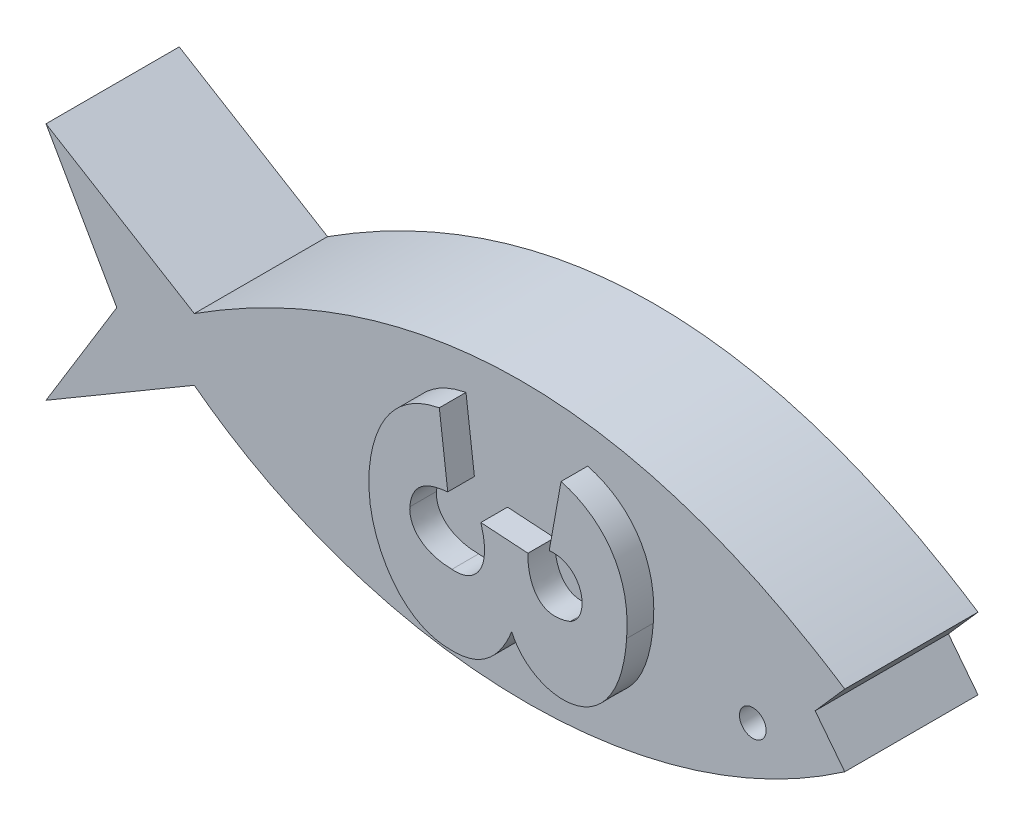
ISO-10303-21;
HEADER;
FILE_DESCRIPTION(('STEP AP214'),'2;1');
FILE_NAME('part.step','',(''),(''),'','','');
FILE_SCHEMA(('AUTOMOTIVE_DESIGN { 1 0 10303 214 1 1 1 1 }'));
ENDSEC;
DATA;
#1=APPLICATION_CONTEXT('core data for automotive mechanical design processes');
#2=APPLICATION_PROTOCOL_DEFINITION('international standard','automotive_design',2000,#1);
#3=PRODUCT_CONTEXT('',#1,'mechanical');
#4=PRODUCT('Part','Part','',(#3));
#5=PRODUCT_RELATED_PRODUCT_CATEGORY('part','',(#4));
#6=PRODUCT_DEFINITION_FORMATION('','',#4);
#7=PRODUCT_DEFINITION_CONTEXT('part definition',#1,'design');
#8=PRODUCT_DEFINITION('design','',#6,#7);
#9=PRODUCT_DEFINITION_SHAPE('','',#8);
#10=(LENGTH_UNIT() NAMED_UNIT(*) SI_UNIT(.MILLI.,.METRE.));
#11=(NAMED_UNIT(*) PLANE_ANGLE_UNIT() SI_UNIT($,.RADIAN.));
#12=(NAMED_UNIT(*) SI_UNIT($,.STERADIAN.) SOLID_ANGLE_UNIT());
#13=UNCERTAINTY_MEASURE_WITH_UNIT(LENGTH_MEASURE(1.E-05),#10,'distance_accuracy_value','');
#14=(GEOMETRIC_REPRESENTATION_CONTEXT(3) GLOBAL_UNCERTAINTY_ASSIGNED_CONTEXT((#13)) GLOBAL_UNIT_ASSIGNED_CONTEXT((#10,
#11,#12)) REPRESENTATION_CONTEXT('',''));
#15=CARTESIAN_POINT('',(0.,0.,0.));
#16=DIRECTION('',(0.,0.,1.));
#17=DIRECTION('',(1.,0.,0.));
#18=AXIS2_PLACEMENT_3D('',#15,#16,#17);
#19=CARTESIAN_POINT('',(17.259438939303,-10.3520637776499,5.));
#20=DIRECTION('',(0.,0.,-1.));
#21=DIRECTION('',(-1.,0.,0.));
#22=AXIS2_PLACEMENT_3D('',#19,#20,#21);
#23=PLANE('',#22);
#24=CARTESIAN_POINT('',(29.9729583496422,-6.64273710384665,5.));
#25=CARTESIAN_POINT('',(22.1417553800262,-12.0787378702692,5.));
#26=CARTESIAN_POINT('',(12.037313537676,-11.2172776076084,5.));
#27=CARTESIAN_POINT('',(5.56534641167516,-6.28572668371996,5.));
#28=B_SPLINE_CURVE_WITH_KNOTS('',3,(#24,#25,#26,#27),.UNSPECIFIED.,.F.,.F.,(4,4),(0.,1.),.UNSPECIFIED.);
#29=CARTESIAN_POINT('',(29.9729583496422,-6.64273710384666,5.));
#30=VERTEX_POINT('',#29);
#31=CARTESIAN_POINT('',(5.56534641167516,-6.28572668371996,5.));
#32=VERTEX_POINT('',#31);
#33=EDGE_CURVE('E210',#30,#32,#28,.T.);
#34=ORIENTED_EDGE('',*,*,#33,.F.);
#35=DIRECTION('',(0.614154388439045,-0.789185901521982,0.));
#36=VECTOR('',#35,1.);
#37=CARTESIAN_POINT('',(29.9729583496422,-6.64273710384666,5.));
#38=LINE('',#37,#36);
#39=CARTESIAN_POINT('',(28.8624377925117,-5.21572268607917,5.));
#40=VERTEX_POINT('',#39);
#41=EDGE_CURVE('E315',#40,#30,#38,.T.);
#42=ORIENTED_EDGE('',*,*,#41,.F.);
#43=DIRECTION('',(-0.660642607187039,-0.750700569847333,0.));
#44=VECTOR('',#43,1.);
#45=CARTESIAN_POINT('',(28.8624377925117,-5.21572268607917,5.));
#46=LINE('',#45,#44);
#47=CARTESIAN_POINT('',(29.9729583496422,-3.95381737449974,5.));
#48=VERTEX_POINT('',#47);
#49=EDGE_CURVE('E238',#48,#40,#46,.T.);
#50=ORIENTED_EDGE('',*,*,#49,.F.);
#51=CARTESIAN_POINT('',(5.56534641167516,-3.95381737449974,5.));
#52=CARTESIAN_POINT('',(17.9190768037639,3.93971731756191,5.));
#53=CARTESIAN_POINT('',(29.9729583496422,-3.95381737449974,5.));
#54=B_SPLINE_CURVE_WITH_KNOTS('',2,(#51,#52,#53),.UNSPECIFIED.,.F.,.F.,(3,3),(0.,1.),.UNSPECIFIED.);
#55=CARTESIAN_POINT('',(5.56534641167516,-3.95381737449974,5.));
#56=VERTEX_POINT('',#55);
#57=EDGE_CURVE('E232',#56,#48,#54,.T.);
#58=ORIENTED_EDGE('',*,*,#57,.F.);
#59=DIRECTION('',(0.854463584925546,-0.519511291538677,0.));
#60=VECTOR('',#59,1.);
#61=CARTESIAN_POINT('',(0.,-0.57010348288733,5.));
#62=LINE('',#61,#60);
#63=CARTESIAN_POINT('',(0.,-0.57010348288733,5.));
#64=VERTEX_POINT('',#63);
#65=EDGE_CURVE('E229',#64,#56,#62,.T.);
#66=ORIENTED_EDGE('',*,*,#65,.F.);
#67=DIRECTION('',(-0.496395302563674,0.868096598076918,0.));
#68=VECTOR('',#67,1.);
#69=CARTESIAN_POINT('',(2.65645960953265,-5.21572268607917,5.));
#70=LINE('',#69,#68);
#71=CARTESIAN_POINT('',(2.65645960953265,-5.21572268607917,5.));
#72=VERTEX_POINT('',#71);
#73=EDGE_CURVE('E226',#72,#64,#70,.T.);
#74=ORIENTED_EDGE('',*,*,#73,.F.);
#75=DIRECTION('',(0.522020846211848,0.852932726608767,0.));
#76=VECTOR('',#75,1.);
#77=CARTESIAN_POINT('',(0.,-9.55612662650962,5.));
#78=LINE('',#77,#76);
#79=CARTESIAN_POINT('',(0.,-9.55612662650962,5.));
#80=VERTEX_POINT('',#79);
#81=EDGE_CURVE('E223',#80,#72,#78,.T.);
#82=ORIENTED_EDGE('',*,*,#81,.F.);
#83=DIRECTION('',(-0.862159793400117,-0.506636448199563,0.));
#84=VECTOR('',#83,1.);
#85=CARTESIAN_POINT('',(5.56534641167516,-6.28572668371996,5.));
#86=LINE('',#85,#84);
#87=EDGE_CURVE('E216',#32,#80,#86,.T.);
#88=ORIENTED_EDGE('',*,*,#87,.F.);
#89=EDGE_LOOP('',(#34,#42,#50,#58,#66,#74,#82,#88));
#90=FACE_BOUND('',#89,.T.);
#91=CARTESIAN_POINT('',(26.5225963003921,-6.78066616591444,5.));
#92=DIRECTION('',(0.,0.,-1.));
#93=DIRECTION('',(-1.,0.,0.));
#94=AXIS2_PLACEMENT_3D('',#91,#92,#93);
#95=CIRCLE('',#94,0.500109692947174);
#96=CARTESIAN_POINT('',(26.0224866074449,-6.78066616591444,5.));
#97=VERTEX_POINT('',#96);
#98=EDGE_CURVE('E202',#97,#97,#95,.T.);
#99=ORIENTED_EDGE('',*,*,#98,.T.);
#100=EDGE_LOOP('',(#99));
#101=FACE_BOUND('',#100,.T.);
#102=CARTESIAN_POINT('',(15.7594494423767,-1.41895303156758,5.));
#103=CARTESIAN_POINT('',(13.3214028190838,-1.88944537605345,5.));
#104=CARTESIAN_POINT('',(13.0534808950552,-4.42870971319118,5.));
#105=CARTESIAN_POINT('',(13.1236711875244,-5.4048919586549,5.));
#106=B_SPLINE_CURVE_WITH_KNOTS('',3,(#102,#103,#104,#105),.UNSPECIFIED.,.F.,.F.,(4,4),(0.,1.),.UNSPECIFIED.);
#107=CARTESIAN_POINT('',(15.7594494423767,-1.41895303156758,5.));
#108=VERTEX_POINT('',#107);
#109=CARTESIAN_POINT('',(13.1236711875244,-5.4048919586549,5.));
#110=VERTEX_POINT('',#109);
#111=EDGE_CURVE('E198',#108,#110,#106,.T.);
#112=ORIENTED_EDGE('',*,*,#111,.F.);
#113=DIRECTION('',(-0.1219069823064,0.992541529440933,0.));
#114=VECTOR('',#113,1.);
#115=CARTESIAN_POINT('',(15.7594494423767,-1.41895303156758,5.));
#116=LINE('',#115,#114);
#117=CARTESIAN_POINT('',(16.0758481304359,-3.99500595173663,5.));
#118=VERTEX_POINT('',#117);
#119=EDGE_CURVE('E195',#118,#108,#116,.T.);
#120=ORIENTED_EDGE('',*,*,#119,.F.);
#121=CARTESIAN_POINT('',(14.6504336042481,-5.19304053566572,5.));
#122=CARTESIAN_POINT('',(14.7409199169432,-4.23839022934074,5.));
#123=CARTESIAN_POINT('',(15.4588807456696,-4.06271008829864,5.));
#124=CARTESIAN_POINT('',(16.0758481304359,-3.99500595173663,5.));
#125=B_SPLINE_CURVE_WITH_KNOTS('',3,(#121,#122,#123,#124),.UNSPECIFIED.,.F.,.F.,(4,4),(0.,1.),.UNSPECIFIED.);
#126=CARTESIAN_POINT('',(14.6504336042481,-5.19304053566572,5.));
#127=VERTEX_POINT('',#126);
#128=EDGE_CURVE('E614',#127,#118,#125,.T.);
#129=ORIENTED_EDGE('',*,*,#128,.F.);
#130=CARTESIAN_POINT('',(16.2321029893553,-6.43243617678024,5.));
#131=CARTESIAN_POINT('',(15.1697807311155,-6.41498041668559,5.));
#132=CARTESIAN_POINT('',(14.619231687316,-5.8621209628539,5.));
#133=CARTESIAN_POINT('',(14.6504336042481,-5.19304053566572,5.));
#134=B_SPLINE_CURVE_WITH_KNOTS('',3,(#130,#131,#132,#133),.UNSPECIFIED.,.F.,.F.,(4,4),(0.,1.),.UNSPECIFIED.);
#135=CARTESIAN_POINT('',(16.2321029893553,-6.43243617678024,5.));
#136=VERTEX_POINT('',#135);
#137=EDGE_CURVE('E606',#136,#127,#134,.T.);
#138=ORIENTED_EDGE('',*,*,#137,.F.);
#139=CARTESIAN_POINT('',(17.3176917422637,-4.36914007634925,5.));
#140=CARTESIAN_POINT('',(17.7801199333051,-5.8698958449194,5.));
#141=CARTESIAN_POINT('',(17.0051882208898,-6.51184143937103,5.));
#142=CARTESIAN_POINT('',(16.2321029893553,-6.43243617678024,5.));
#143=B_SPLINE_CURVE_WITH_KNOTS('',3,(#139,#140,#141,#142),.UNSPECIFIED.,.F.,.F.,(4,4),(0.,1.),.UNSPECIFIED.);
#144=CARTESIAN_POINT('',(17.3176917422637,-4.36914007634925,5.));
#145=VERTEX_POINT('',#144);
#146=EDGE_CURVE('E601',#145,#136,#143,.T.);
#147=ORIENTED_EDGE('',*,*,#146,.F.);
#148=DIRECTION('',(-0.997945127143893,0.0640743568813564,0.));
#149=VECTOR('',#148,1.);
#150=CARTESIAN_POINT('',(17.3176917422637,-4.36914007634925,5.));
#151=LINE('',#150,#149);
#152=CARTESIAN_POINT('',(19.0853994004367,-4.48263803156834,5.));
#153=VERTEX_POINT('',#152);
#154=EDGE_CURVE('E595',#153,#145,#151,.T.);
#155=ORIENTED_EDGE('',*,*,#154,.F.);
#156=CARTESIAN_POINT('',(20.6694193700612,-5.9114364985291,5.));
#157=CARTESIAN_POINT('',(19.2582032537697,-6.43904431320186,5.));
#158=CARTESIAN_POINT('',(19.0561185015125,-4.99719531210255,5.));
#159=CARTESIAN_POINT('',(19.0853994004367,-4.48263803156834,5.));
#160=B_SPLINE_CURVE_WITH_KNOTS('',3,(#156,#157,#158,#159),.UNSPECIFIED.,.F.,.F.,(4,4),(0.,1.),.UNSPECIFIED.);
#161=CARTESIAN_POINT('',(20.6694193700612,-5.9114364985291,5.));
#162=VERTEX_POINT('',#161);
#163=EDGE_CURVE('E587',#162,#153,#160,.T.);
#164=ORIENTED_EDGE('',*,*,#163,.F.);
#165=CARTESIAN_POINT('',(19.8843250961511,-3.99500595173663,5.));
#166=CARTESIAN_POINT('',(21.1622515732172,-3.88331869581976,5.));
#167=CARTESIAN_POINT('',(21.4863444731382,-5.4578923753377,5.));
#168=CARTESIAN_POINT('',(20.6694193700612,-5.9114364985291,5.));
#169=B_SPLINE_CURVE_WITH_KNOTS('',3,(#165,#166,#167,#168),.UNSPECIFIED.,.F.,.F.,(4,4),(0.,1.),.UNSPECIFIED.);
#170=CARTESIAN_POINT('',(19.8843250961511,-3.99500595173663,5.));
#171=VERTEX_POINT('',#170);
#172=EDGE_CURVE('E582',#171,#162,#169,.T.);
#173=ORIENTED_EDGE('',*,*,#172,.F.);
#174=DIRECTION('',(-0.176924790839591,-0.984224374005423,0.));
#175=VECTOR('',#174,1.);
#176=CARTESIAN_POINT('',(20.327479071403,-1.52976102020119,5.));
#177=LINE('',#176,#175);
#178=CARTESIAN_POINT('',(20.327479071403,-1.52976102020119,5.));
#179=VERTEX_POINT('',#178);
#180=EDGE_CURVE('E576',#179,#171,#177,.T.);
#181=ORIENTED_EDGE('',*,*,#180,.F.);
#182=CARTESIAN_POINT('',(22.78767453301,-5.4048919586549,5.));
#183=CARTESIAN_POINT('',(22.9638366784882,-3.33714422481485,5.));
#184=CARTESIAN_POINT('',(21.949807026721,-1.97801039519656,5.));
#185=CARTESIAN_POINT('',(20.327479071403,-1.52976102020119,5.));
#186=B_SPLINE_CURVE_WITH_KNOTS('',3,(#182,#183,#184,#185),.UNSPECIFIED.,.F.,.F.,(4,4),(0.,1.),.UNSPECIFIED.);
#187=CARTESIAN_POINT('',(22.78767453301,-5.4048919586549,5.));
#188=VERTEX_POINT('',#187);
#189=EDGE_CURVE('E568',#188,#179,#186,.T.);
#190=ORIENTED_EDGE('',*,*,#189,.F.);
#191=CARTESIAN_POINT('',(18.4748741932506,-7.3381299262536,5.));
#192=CARTESIAN_POINT('',(19.2493214302989,-9.10179018253669,5.));
#193=CARTESIAN_POINT('',(22.5092789715667,-9.42928976939499,5.));
#194=CARTESIAN_POINT('',(22.78767453301,-5.4048919586549,5.));
#195=B_SPLINE_CURVE_WITH_KNOTS('',3,(#191,#192,#193,#194),.UNSPECIFIED.,.F.,.F.,(4,4),(0.,1.),.UNSPECIFIED.);
#196=CARTESIAN_POINT('',(18.4748741932506,-7.3381299262536,5.));
#197=VERTEX_POINT('',#196);
#198=EDGE_CURVE('E560',#197,#188,#195,.T.);
#199=ORIENTED_EDGE('',*,*,#198,.F.);
#200=CARTESIAN_POINT('',(16.0758481304359,-9.06636741980549,5.));
#201=CARTESIAN_POINT('',(17.7334229603927,-9.19346654370424,5.));
#202=CARTESIAN_POINT('',(18.4748741932506,-7.3381299262536,5.));
#203=B_SPLINE_CURVE_WITH_KNOTS('',2,(#200,#201,#202),.UNSPECIFIED.,.F.,.F.,(3,3),(0.,1.),.UNSPECIFIED.);
#204=CARTESIAN_POINT('',(16.0758481304359,-9.06636741980549,5.));
#205=VERTEX_POINT('',#204);
#206=EDGE_CURVE('E56',#205,#197,#203,.T.);
#207=ORIENTED_EDGE('',*,*,#206,.F.);
#208=CARTESIAN_POINT('',(13.1236711875244,-5.4048919586549,5.));
#209=CARTESIAN_POINT('',(13.1735981973362,-6.97188897694914,5.));
#210=CARTESIAN_POINT('',(14.2444107179174,-9.0173129878104,5.));
#211=CARTESIAN_POINT('',(16.0758481304359,-9.06636741980549,5.));
#212=B_SPLINE_CURVE_WITH_KNOTS('',3,(#208,#209,#210,#211),.UNSPECIFIED.,.F.,.F.,(4,4),(0.,1.),.UNSPECIFIED.);
#213=EDGE_CURVE('E51',#110,#205,#212,.T.);
#214=ORIENTED_EDGE('',*,*,#213,.F.);
#215=EDGE_LOOP('',(#112,#120,#129,#138,#147,#155,#164,#173,#181,#190,#199,#207,#214));
#216=FACE_BOUND('',#215,.T.);
#217=ADVANCED_FACE('F33',(#90,#101,#216),#23,.F.);
#218=DIRECTION('',(0.,0.,-1.));
#219=VECTOR('',#218,1.);
#220=SURFACE_OF_LINEAR_EXTRUSION('',#28,#219);
#221=CARTESIAN_POINT('',(29.9729583496422,-6.64273710384665,0.));
#222=CARTESIAN_POINT('',(22.1417553800262,-12.0787378702692,0.));
#223=CARTESIAN_POINT('',(12.037313537676,-11.2172776076084,0.));
#224=CARTESIAN_POINT('',(5.56534641167516,-6.28572668371996,0.));
#225=B_SPLINE_CURVE_WITH_KNOTS('',3,(#221,#222,#223,#224),.UNSPECIFIED.,.F.,.F.,(4,4),(0.,1.),.UNSPECIFIED.);
#226=CARTESIAN_POINT('',(29.9729583496422,-6.64273710384666,0.));
#227=VERTEX_POINT('',#226);
#228=CARTESIAN_POINT('',(5.56534641167516,-6.28572668371996,0.));
#229=VERTEX_POINT('',#228);
#230=EDGE_CURVE('E209',#227,#229,#225,.T.);
#231=ORIENTED_EDGE('',*,*,#230,.F.);
#232=DIRECTION('',(0.,0.,-1.));
#233=VECTOR('',#232,1.);
#234=CARTESIAN_POINT('',(29.9729583496422,-6.64273710384666,5.));
#235=LINE('',#234,#233);
#236=EDGE_CURVE('E11',#30,#227,#235,.T.);
#237=ORIENTED_EDGE('',*,*,#236,.F.);
#238=ORIENTED_EDGE('',*,*,#33,.T.);
#239=DIRECTION('',(0.,0.,-1.));
#240=VECTOR('',#239,1.);
#241=CARTESIAN_POINT('',(5.56534641167516,-6.28572668371996,5.));
#242=LINE('',#241,#240);
#243=EDGE_CURVE('E38',#32,#229,#242,.T.);
#244=ORIENTED_EDGE('',*,*,#243,.T.);
#245=EDGE_LOOP('',(#231,#237,#238,#244));
#246=FACE_BOUND('',#245,.T.);
#247=ADVANCED_FACE('F35',(#246),#220,.T.);
#248=CARTESIAN_POINT('',(29.9729583496422,-6.64273710384666,5.));
#249=DIRECTION('',(0.789185901521982,0.614154388439045,0.));
#250=DIRECTION('',(-0.614154388439045,0.789185901521982,0.));
#251=AXIS2_PLACEMENT_3D('',#248,#249,#250);
#252=PLANE('',#251);
#253=DIRECTION('',(0.614154388439045,-0.789185901521982,0.));
#254=VECTOR('',#253,1.);
#255=CARTESIAN_POINT('',(29.9729583496422,-6.64273710384666,0.));
#256=LINE('',#255,#254);
#257=CARTESIAN_POINT('',(28.8624377925117,-5.21572268607917,0.));
#258=VERTEX_POINT('',#257);
#259=EDGE_CURVE('E217',#258,#227,#256,.T.);
#260=ORIENTED_EDGE('',*,*,#259,.F.);
#261=DIRECTION('',(0.,0.,-1.));
#262=VECTOR('',#261,1.);
#263=CARTESIAN_POINT('',(28.8624377925117,-5.21572268607917,5.));
#264=LINE('',#263,#262);
#265=EDGE_CURVE('E43',#40,#258,#264,.T.);
#266=ORIENTED_EDGE('',*,*,#265,.F.);
#267=ORIENTED_EDGE('',*,*,#41,.T.);
#268=ORIENTED_EDGE('',*,*,#236,.T.);
#269=EDGE_LOOP('',(#260,#266,#267,#268));
#270=FACE_BOUND('',#269,.T.);
#271=ADVANCED_FACE('F279',(#270),#252,.T.);
#272=CARTESIAN_POINT('',(28.8624377925117,-5.21572268607917,5.));
#273=DIRECTION('',(0.750700569847333,-0.660642607187039,0.));
#274=DIRECTION('',(0.660642607187039,0.750700569847334,0.));
#275=AXIS2_PLACEMENT_3D('',#272,#273,#274);
#276=PLANE('',#275);
#277=DIRECTION('',(-0.660642607187039,-0.750700569847333,0.));
#278=VECTOR('',#277,1.);
#279=CARTESIAN_POINT('',(28.8624377925117,-5.21572268607917,0.));
#280=LINE('',#279,#278);
#281=CARTESIAN_POINT('',(29.9729583496422,-3.95381737449974,0.));
#282=VERTEX_POINT('',#281);
#283=EDGE_CURVE('E299',#282,#258,#280,.T.);
#284=ORIENTED_EDGE('',*,*,#283,.F.);
#285=DIRECTION('',(0.,0.,-1.));
#286=VECTOR('',#285,1.);
#287=CARTESIAN_POINT('',(29.9729583496422,-3.95381737449974,5.));
#288=LINE('',#287,#286);
#289=EDGE_CURVE('E306',#48,#282,#288,.T.);
#290=ORIENTED_EDGE('',*,*,#289,.F.);
#291=ORIENTED_EDGE('',*,*,#49,.T.);
#292=ORIENTED_EDGE('',*,*,#265,.T.);
#293=EDGE_LOOP('',(#284,#290,#291,#292));
#294=FACE_BOUND('',#293,.T.);
#295=ADVANCED_FACE('F249',(#294),#276,.T.);
#296=DIRECTION('',(0.,0.,-1.));
#297=VECTOR('',#296,1.);
#298=SURFACE_OF_LINEAR_EXTRUSION('',#54,#297);
#299=CARTESIAN_POINT('',(5.56534641167516,-3.95381737449974,0.));
#300=CARTESIAN_POINT('',(17.9190768037639,3.93971731756191,0.));
#301=CARTESIAN_POINT('',(29.9729583496422,-3.95381737449974,0.));
#302=B_SPLINE_CURVE_WITH_KNOTS('',2,(#299,#300,#301),.UNSPECIFIED.,.F.,.F.,(3,3),(0.,1.),.UNSPECIFIED.);
#303=CARTESIAN_POINT('',(5.56534641167516,-3.95381737449974,0.));
#304=VERTEX_POINT('',#303);
#305=EDGE_CURVE('E301',#304,#282,#302,.T.);
#306=ORIENTED_EDGE('',*,*,#305,.F.);
#307=DIRECTION('',(0.,0.,-1.));
#308=VECTOR('',#307,1.);
#309=CARTESIAN_POINT('',(5.56534641167516,-3.95381737449974,5.));
#310=LINE('',#309,#308);
#311=EDGE_CURVE('E308',#56,#304,#310,.T.);
#312=ORIENTED_EDGE('',*,*,#311,.F.);
#313=ORIENTED_EDGE('',*,*,#57,.T.);
#314=ORIENTED_EDGE('',*,*,#289,.T.);
#315=EDGE_LOOP('',(#306,#312,#313,#314));
#316=FACE_BOUND('',#315,.T.);
#317=ADVANCED_FACE('F244',(#316),#298,.T.);
#318=CARTESIAN_POINT('',(0.,-0.57010348288733,5.));
#319=DIRECTION('',(0.519511291538677,0.854463584925546,0.));
#320=DIRECTION('',(-0.854463584925546,0.519511291538677,0.));
#321=AXIS2_PLACEMENT_3D('',#318,#319,#320);
#322=PLANE('',#321);
#323=DIRECTION('',(0.854463584925546,-0.519511291538677,0.));
#324=VECTOR('',#323,1.);
#325=CARTESIAN_POINT('',(0.,-0.57010348288733,0.));
#326=LINE('',#325,#324);
#327=CARTESIAN_POINT('',(0.,-0.57010348288733,0.));
#328=VERTEX_POINT('',#327);
#329=EDGE_CURVE('E333',#328,#304,#326,.T.);
#330=ORIENTED_EDGE('',*,*,#329,.F.);
#331=DIRECTION('',(0.,0.,-1.));
#332=VECTOR('',#331,1.);
#333=CARTESIAN_POINT('',(0.,-0.57010348288733,5.));
#334=LINE('',#333,#332);
#335=EDGE_CURVE('E310',#64,#328,#334,.T.);
#336=ORIENTED_EDGE('',*,*,#335,.F.);
#337=ORIENTED_EDGE('',*,*,#65,.T.);
#338=ORIENTED_EDGE('',*,*,#311,.T.);
#339=EDGE_LOOP('',(#330,#336,#337,#338));
#340=FACE_BOUND('',#339,.T.);
#341=ADVANCED_FACE('F248',(#340),#322,.T.);
#342=CARTESIAN_POINT('',(2.65645960953265,-5.21572268607917,5.));
#343=DIRECTION('',(-0.868096598076918,-0.496395302563674,0.));
#344=DIRECTION('',(0.496395302563674,-0.868096598076918,0.));
#345=AXIS2_PLACEMENT_3D('',#342,#343,#344);
#346=PLANE('',#345);
#347=DIRECTION('',(-0.496395302563674,0.868096598076918,0.));
#348=VECTOR('',#347,1.);
#349=CARTESIAN_POINT('',(2.65645960953265,-5.21572268607917,0.));
#350=LINE('',#349,#348);
#351=CARTESIAN_POINT('',(2.65645960953265,-5.21572268607917,0.));
#352=VERTEX_POINT('',#351);
#353=EDGE_CURVE('E330',#352,#328,#350,.T.);
#354=ORIENTED_EDGE('',*,*,#353,.F.);
#355=DIRECTION('',(0.,0.,-1.));
#356=VECTOR('',#355,1.);
#357=CARTESIAN_POINT('',(2.65645960953265,-5.21572268607917,5.));
#358=LINE('',#357,#356);
#359=EDGE_CURVE('E312',#72,#352,#358,.T.);
#360=ORIENTED_EDGE('',*,*,#359,.F.);
#361=ORIENTED_EDGE('',*,*,#73,.T.);
#362=ORIENTED_EDGE('',*,*,#335,.T.);
#363=EDGE_LOOP('',(#354,#360,#361,#362));
#364=FACE_BOUND('',#363,.T.);
#365=ADVANCED_FACE('F254',(#364),#346,.T.);
#366=CARTESIAN_POINT('',(0.,-9.55612662650962,5.));
#367=DIRECTION('',(-0.852932726608767,0.522020846211848,0.));
#368=DIRECTION('',(-0.522020846211848,-0.852932726608767,0.));
#369=AXIS2_PLACEMENT_3D('',#366,#367,#368);
#370=PLANE('',#369);
#371=DIRECTION('',(0.522020846211848,0.852932726608767,0.));
#372=VECTOR('',#371,1.);
#373=CARTESIAN_POINT('',(0.,-9.55612662650962,0.));
#374=LINE('',#373,#372);
#375=CARTESIAN_POINT('',(0.,-9.55612662650962,0.));
#376=VERTEX_POINT('',#375);
#377=EDGE_CURVE('E327',#376,#352,#374,.T.);
#378=ORIENTED_EDGE('',*,*,#377,.F.);
#379=DIRECTION('',(0.,0.,-1.));
#380=VECTOR('',#379,1.);
#381=CARTESIAN_POINT('',(0.,-9.55612662650962,5.));
#382=LINE('',#381,#380);
#383=EDGE_CURVE('E313',#80,#376,#382,.T.);
#384=ORIENTED_EDGE('',*,*,#383,.F.);
#385=ORIENTED_EDGE('',*,*,#81,.T.);
#386=ORIENTED_EDGE('',*,*,#359,.T.);
#387=EDGE_LOOP('',(#378,#384,#385,#386));
#388=FACE_BOUND('',#387,.T.);
#389=ADVANCED_FACE('F258',(#388),#370,.T.);
#390=CARTESIAN_POINT('',(5.56534641167516,-6.28572668371996,5.));
#391=DIRECTION('',(0.506636448199563,-0.862159793400117,0.));
#392=DIRECTION('',(0.862159793400117,0.506636448199563,0.));
#393=AXIS2_PLACEMENT_3D('',#390,#391,#392);
#394=PLANE('',#393);
#395=DIRECTION('',(-0.862159793400117,-0.506636448199563,0.));
#396=VECTOR('',#395,1.);
#397=CARTESIAN_POINT('',(5.56534641167516,-6.28572668371996,0.));
#398=LINE('',#397,#396);
#399=EDGE_CURVE('E321',#229,#376,#398,.T.);
#400=ORIENTED_EDGE('',*,*,#399,.F.);
#401=ORIENTED_EDGE('',*,*,#243,.F.);
#402=ORIENTED_EDGE('',*,*,#87,.T.);
#403=ORIENTED_EDGE('',*,*,#383,.T.);
#404=EDGE_LOOP('',(#400,#401,#402,#403));
#405=FACE_BOUND('',#404,.T.);
#406=ADVANCED_FACE('F261',(#405),#394,.T.);
#407=CARTESIAN_POINT('',(17.259438939303,-10.3520637776499,0.));
#408=DIRECTION('',(0.,0.,-1.));
#409=DIRECTION('',(-1.,0.,0.));
#410=AXIS2_PLACEMENT_3D('',#407,#408,#409);
#411=PLANE('',#410);
#412=CARTESIAN_POINT('',(26.5225963003921,-6.78066616591444,0.));
#413=DIRECTION('',(0.,0.,-1.));
#414=DIRECTION('',(-1.,0.,0.));
#415=AXIS2_PLACEMENT_3D('',#412,#413,#414);
#416=CIRCLE('',#415,0.500109692947174);
#417=CARTESIAN_POINT('',(26.0224866074449,-6.78066616591444,0.));
#418=VERTEX_POINT('',#417);
#419=EDGE_CURVE('E199',#418,#418,#416,.T.);
#420=ORIENTED_EDGE('',*,*,#419,.F.);
#421=EDGE_LOOP('',(#420));
#422=FACE_BOUND('',#421,.T.);
#423=ORIENTED_EDGE('',*,*,#230,.T.);
#424=ORIENTED_EDGE('',*,*,#399,.T.);
#425=ORIENTED_EDGE('',*,*,#377,.T.);
#426=ORIENTED_EDGE('',*,*,#353,.T.);
#427=ORIENTED_EDGE('',*,*,#329,.T.);
#428=ORIENTED_EDGE('',*,*,#305,.T.);
#429=ORIENTED_EDGE('',*,*,#283,.T.);
#430=ORIENTED_EDGE('',*,*,#259,.T.);
#431=EDGE_LOOP('',(#423,#424,#425,#426,#427,#428,#429,#430));
#432=FACE_BOUND('',#431,.T.);
#433=ADVANCED_FACE('F264',(#422,#432),#411,.T.);
#434=CARTESIAN_POINT('',(26.5225963003921,-6.78066616591444,5.));
#435=DIRECTION('',(0.,0.,-1.));
#436=DIRECTION('',(-1.,0.,0.));
#437=AXIS2_PLACEMENT_3D('',#434,#435,#436);
#438=CYLINDRICAL_SURFACE('',#437,0.500109692947174);
#439=ORIENTED_EDGE('',*,*,#98,.F.);
#440=EDGE_LOOP('',(#439));
#441=FACE_BOUND('',#440,.T.);
#442=ORIENTED_EDGE('',*,*,#419,.T.);
#443=EDGE_LOOP('',(#442));
#444=FACE_BOUND('',#443,.T.);
#445=ADVANCED_FACE('F269',(#441,#444),#438,.F.);
#446=CARTESIAN_POINT('',(15.7594494423767,-1.41895303156758,6.));
#447=CARTESIAN_POINT('',(13.3214028190838,-1.88944537605345,6.));
#448=CARTESIAN_POINT('',(13.0534808950552,-4.42870971319118,6.));
#449=CARTESIAN_POINT('',(13.1236711875244,-5.4048919586549,6.));
#450=B_SPLINE_CURVE_WITH_KNOTS('',3,(#446,#447,#448,#449),.UNSPECIFIED.,.F.,.F.,(4,4),(0.,1.),.UNSPECIFIED.);
#451=DIRECTION('',(0.,0.,-1.));
#452=VECTOR('',#451,1.);
#453=SURFACE_OF_LINEAR_EXTRUSION('',#450,#452);
#454=ORIENTED_EDGE('',*,*,#111,.T.);
#455=DIRECTION('',(0.,0.,-1.));
#456=VECTOR('',#455,1.);
#457=CARTESIAN_POINT('',(13.1236711875244,-5.4048919586549,6.));
#458=LINE('',#457,#456);
#459=CARTESIAN_POINT('',(13.1236711875244,-5.4048919586549,6.));
#460=VERTEX_POINT('',#459);
#461=EDGE_CURVE('E179',#460,#110,#458,.T.);
#462=ORIENTED_EDGE('',*,*,#461,.F.);
#463=CARTESIAN_POINT('',(15.7594494423767,-1.41895303156758,6.));
#464=VERTEX_POINT('',#463);
#465=EDGE_CURVE('E186',#464,#460,#450,.T.);
#466=ORIENTED_EDGE('',*,*,#465,.F.);
#467=DIRECTION('',(0.,0.,-1.));
#468=VECTOR('',#467,1.);
#469=CARTESIAN_POINT('',(15.7594494423767,-1.41895303156758,6.));
#470=LINE('',#469,#468);
#471=EDGE_CURVE('E544',#464,#108,#470,.T.);
#472=ORIENTED_EDGE('',*,*,#471,.T.);
#473=EDGE_LOOP('',(#454,#462,#466,#472));
#474=FACE_BOUND('',#473,.T.);
#475=ADVANCED_FACE('F197',(#474),#453,.F.);
#476=CARTESIAN_POINT('',(13.1236711875244,-5.4048919586549,6.));
#477=CARTESIAN_POINT('',(13.1735981973362,-6.97188897694914,6.));
#478=CARTESIAN_POINT('',(14.2444107179174,-9.0173129878104,6.));
#479=CARTESIAN_POINT('',(16.0758481304359,-9.06636741980549,6.));
#480=B_SPLINE_CURVE_WITH_KNOTS('',3,(#476,#477,#478,#479),.UNSPECIFIED.,.F.,.F.,(4,4),(0.,1.),.UNSPECIFIED.);
#481=DIRECTION('',(0.,0.,-1.));
#482=VECTOR('',#481,1.);
#483=SURFACE_OF_LINEAR_EXTRUSION('',#480,#482);
#484=ORIENTED_EDGE('',*,*,#213,.T.);
#485=DIRECTION('',(0.,0.,-1.));
#486=VECTOR('',#485,1.);
#487=CARTESIAN_POINT('',(16.0758481304359,-9.06636741980549,6.));
#488=LINE('',#487,#486);
#489=CARTESIAN_POINT('',(16.0758481304359,-9.06636741980549,6.));
#490=VERTEX_POINT('',#489);
#491=EDGE_CURVE('E182',#490,#205,#488,.T.);
#492=ORIENTED_EDGE('',*,*,#491,.F.);
#493=EDGE_CURVE('E175',#460,#490,#480,.T.);
#494=ORIENTED_EDGE('',*,*,#493,.F.);
#495=ORIENTED_EDGE('',*,*,#461,.T.);
#496=EDGE_LOOP('',(#484,#492,#494,#495));
#497=FACE_BOUND('',#496,.T.);
#498=ADVANCED_FACE('F177',(#497),#483,.F.);
#499=CARTESIAN_POINT('',(16.0758481304359,-9.06636741980549,6.));
#500=CARTESIAN_POINT('',(17.7334229603927,-9.19346654370424,6.));
#501=CARTESIAN_POINT('',(18.4748741932506,-7.3381299262536,6.));
#502=B_SPLINE_CURVE_WITH_KNOTS('',2,(#499,#500,#501),.UNSPECIFIED.,.F.,.F.,(3,3),(0.,1.),.UNSPECIFIED.);
#503=DIRECTION('',(0.,0.,-1.));
#504=VECTOR('',#503,1.);
#505=SURFACE_OF_LINEAR_EXTRUSION('',#502,#504);
#506=ORIENTED_EDGE('',*,*,#206,.T.);
#507=DIRECTION('',(0.,0.,-1.));
#508=VECTOR('',#507,1.);
#509=CARTESIAN_POINT('',(18.4748741932506,-7.3381299262536,6.));
#510=LINE('',#509,#508);
#511=CARTESIAN_POINT('',(18.4748741932506,-7.3381299262536,6.));
#512=VERTEX_POINT('',#511);
#513=EDGE_CURVE('E204',#512,#197,#510,.T.);
#514=ORIENTED_EDGE('',*,*,#513,.F.);
#515=EDGE_CURVE('E185',#490,#512,#502,.T.);
#516=ORIENTED_EDGE('',*,*,#515,.F.);
#517=ORIENTED_EDGE('',*,*,#491,.T.);
#518=EDGE_LOOP('',(#506,#514,#516,#517));
#519=FACE_BOUND('',#518,.T.);
#520=ADVANCED_FACE('F407',(#519),#505,.F.);
#521=CARTESIAN_POINT('',(18.4748741932506,-7.3381299262536,6.));
#522=CARTESIAN_POINT('',(19.2493214302989,-9.10179018253669,6.));
#523=CARTESIAN_POINT('',(22.5092789715667,-9.42928976939499,6.));
#524=CARTESIAN_POINT('',(22.78767453301,-5.4048919586549,6.));
#525=B_SPLINE_CURVE_WITH_KNOTS('',3,(#521,#522,#523,#524),.UNSPECIFIED.,.F.,.F.,(4,4),(0.,1.),.UNSPECIFIED.);
#526=DIRECTION('',(0.,0.,-1.));
#527=VECTOR('',#526,1.);
#528=SURFACE_OF_LINEAR_EXTRUSION('',#525,#527);
#529=ORIENTED_EDGE('',*,*,#198,.T.);
#530=DIRECTION('',(0.,0.,-1.));
#531=VECTOR('',#530,1.);
#532=CARTESIAN_POINT('',(22.78767453301,-5.4048919586549,6.));
#533=LINE('',#532,#531);
#534=CARTESIAN_POINT('',(22.78767453301,-5.4048919586549,6.));
#535=VERTEX_POINT('',#534);
#536=EDGE_CURVE('E652',#535,#188,#533,.T.);
#537=ORIENTED_EDGE('',*,*,#536,.F.);
#538=EDGE_CURVE('E658',#512,#535,#525,.T.);
#539=ORIENTED_EDGE('',*,*,#538,.F.);
#540=ORIENTED_EDGE('',*,*,#513,.T.);
#541=EDGE_LOOP('',(#529,#537,#539,#540));
#542=FACE_BOUND('',#541,.T.);
#543=ADVANCED_FACE('F416',(#542),#528,.F.);
#544=CARTESIAN_POINT('',(22.78767453301,-5.4048919586549,6.));
#545=CARTESIAN_POINT('',(22.9638366784882,-3.33714422481485,6.));
#546=CARTESIAN_POINT('',(21.949807026721,-1.97801039519656,6.));
#547=CARTESIAN_POINT('',(20.327479071403,-1.52976102020119,6.));
#548=B_SPLINE_CURVE_WITH_KNOTS('',3,(#544,#545,#546,#547),.UNSPECIFIED.,.F.,.F.,(4,4),(0.,1.),.UNSPECIFIED.);
#549=DIRECTION('',(0.,0.,-1.));
#550=VECTOR('',#549,1.);
#551=SURFACE_OF_LINEAR_EXTRUSION('',#548,#550);
#552=ORIENTED_EDGE('',*,*,#189,.T.);
#553=DIRECTION('',(0.,0.,-1.));
#554=VECTOR('',#553,1.);
#555=CARTESIAN_POINT('',(20.327479071403,-1.52976102020119,6.));
#556=LINE('',#555,#554);
#557=CARTESIAN_POINT('',(20.327479071403,-1.52976102020119,6.));
#558=VERTEX_POINT('',#557);
#559=EDGE_CURVE('E649',#558,#179,#556,.T.);
#560=ORIENTED_EDGE('',*,*,#559,.F.);
#561=EDGE_CURVE('E660',#535,#558,#548,.T.);
#562=ORIENTED_EDGE('',*,*,#561,.F.);
#563=ORIENTED_EDGE('',*,*,#536,.T.);
#564=EDGE_LOOP('',(#552,#560,#562,#563));
#565=FACE_BOUND('',#564,.T.);
#566=ADVANCED_FACE('F426',(#565),#551,.F.);
#567=CARTESIAN_POINT('',(20.327479071403,-1.52976102020119,6.));
#568=DIRECTION('',(0.984224374005423,-0.176924790839591,0.));
#569=DIRECTION('',(0.176924790839591,0.984224374005423,0.));
#570=AXIS2_PLACEMENT_3D('',#567,#568,#569);
#571=PLANE('',#570);
#572=ORIENTED_EDGE('',*,*,#180,.T.);
#573=DIRECTION('',(0.,0.,-1.));
#574=VECTOR('',#573,1.);
#575=CARTESIAN_POINT('',(19.8843250961511,-3.99500595173663,6.));
#576=LINE('',#575,#574);
#577=CARTESIAN_POINT('',(19.8843250961511,-3.99500595173663,6.));
#578=VERTEX_POINT('',#577);
#579=EDGE_CURVE('E646',#578,#171,#576,.T.);
#580=ORIENTED_EDGE('',*,*,#579,.F.);
#581=DIRECTION('',(-0.176924790839591,-0.984224374005423,0.));
#582=VECTOR('',#581,1.);
#583=CARTESIAN_POINT('',(20.327479071403,-1.52976102020119,6.));
#584=LINE('',#583,#582);
#585=EDGE_CURVE('E685',#558,#578,#584,.T.);
#586=ORIENTED_EDGE('',*,*,#585,.F.);
#587=ORIENTED_EDGE('',*,*,#559,.T.);
#588=EDGE_LOOP('',(#572,#580,#586,#587));
#589=FACE_BOUND('',#588,.T.);
#590=ADVANCED_FACE('F436',(#589),#571,.F.);
#591=CARTESIAN_POINT('',(19.8843250961511,-3.99500595173663,6.));
#592=CARTESIAN_POINT('',(21.1622515732172,-3.88331869581976,6.));
#593=CARTESIAN_POINT('',(21.4863444731382,-5.4578923753377,6.));
#594=CARTESIAN_POINT('',(20.6694193700612,-5.9114364985291,6.));
#595=B_SPLINE_CURVE_WITH_KNOTS('',3,(#591,#592,#593,#594),.UNSPECIFIED.,.F.,.F.,(4,4),(0.,1.),.UNSPECIFIED.);
#596=DIRECTION('',(0.,0.,-1.));
#597=VECTOR('',#596,1.);
#598=SURFACE_OF_LINEAR_EXTRUSION('',#595,#597);
#599=ORIENTED_EDGE('',*,*,#172,.T.);
#600=DIRECTION('',(0.,0.,-1.));
#601=VECTOR('',#600,1.);
#602=CARTESIAN_POINT('',(20.6694193700612,-5.9114364985291,6.));
#603=LINE('',#602,#601);
#604=CARTESIAN_POINT('',(20.6694193700612,-5.9114364985291,6.));
#605=VERTEX_POINT('',#604);
#606=EDGE_CURVE('E643',#605,#162,#603,.T.);
#607=ORIENTED_EDGE('',*,*,#606,.F.);
#608=EDGE_CURVE('E690',#578,#605,#595,.T.);
#609=ORIENTED_EDGE('',*,*,#608,.F.);
#610=ORIENTED_EDGE('',*,*,#579,.T.);
#611=EDGE_LOOP('',(#599,#607,#609,#610));
#612=FACE_BOUND('',#611,.T.);
#613=ADVANCED_FACE('F446',(#612),#598,.F.);
#614=CARTESIAN_POINT('',(20.6694193700612,-5.9114364985291,6.));
#615=CARTESIAN_POINT('',(19.2582032537697,-6.43904431320186,6.));
#616=CARTESIAN_POINT('',(19.0561185015125,-4.99719531210255,6.));
#617=CARTESIAN_POINT('',(19.0853994004367,-4.48263803156834,6.));
#618=B_SPLINE_CURVE_WITH_KNOTS('',3,(#614,#615,#616,#617),.UNSPECIFIED.,.F.,.F.,(4,4),(0.,1.),.UNSPECIFIED.);
#619=DIRECTION('',(0.,0.,-1.));
#620=VECTOR('',#619,1.);
#621=SURFACE_OF_LINEAR_EXTRUSION('',#618,#620);
#622=ORIENTED_EDGE('',*,*,#163,.T.);
#623=DIRECTION('',(0.,0.,-1.));
#624=VECTOR('',#623,1.);
#625=CARTESIAN_POINT('',(19.0853994004367,-4.48263803156834,6.));
#626=LINE('',#625,#624);
#627=CARTESIAN_POINT('',(19.0853994004367,-4.48263803156834,6.));
#628=VERTEX_POINT('',#627);
#629=EDGE_CURVE('E640',#628,#153,#626,.T.);
#630=ORIENTED_EDGE('',*,*,#629,.F.);
#631=EDGE_CURVE('E695',#605,#628,#618,.T.);
#632=ORIENTED_EDGE('',*,*,#631,.F.);
#633=ORIENTED_EDGE('',*,*,#606,.T.);
#634=EDGE_LOOP('',(#622,#630,#632,#633));
#635=FACE_BOUND('',#634,.T.);
#636=ADVANCED_FACE('F456',(#635),#621,.F.);
#637=CARTESIAN_POINT('',(17.3176917422637,-4.36914007634925,6.));
#638=DIRECTION('',(-0.0640743568813564,-0.997945127143893,0.));
#639=DIRECTION('',(0.997945127143893,-0.0640743568813564,0.));
#640=AXIS2_PLACEMENT_3D('',#637,#638,#639);
#641=PLANE('',#640);
#642=ORIENTED_EDGE('',*,*,#154,.T.);
#643=DIRECTION('',(0.,0.,-1.));
#644=VECTOR('',#643,1.);
#645=CARTESIAN_POINT('',(17.3176917422637,-4.36914007634925,6.));
#646=LINE('',#645,#644);
#647=CARTESIAN_POINT('',(17.3176917422637,-4.36914007634925,6.));
#648=VERTEX_POINT('',#647);
#649=EDGE_CURVE('E637',#648,#145,#646,.T.);
#650=ORIENTED_EDGE('',*,*,#649,.F.);
#651=DIRECTION('',(-0.997945127143893,0.0640743568813564,0.));
#652=VECTOR('',#651,1.);
#653=CARTESIAN_POINT('',(17.3176917422637,-4.36914007634925,6.));
#654=LINE('',#653,#652);
#655=EDGE_CURVE('E707',#628,#648,#654,.T.);
#656=ORIENTED_EDGE('',*,*,#655,.F.);
#657=ORIENTED_EDGE('',*,*,#629,.T.);
#658=EDGE_LOOP('',(#642,#650,#656,#657));
#659=FACE_BOUND('',#658,.T.);
#660=ADVANCED_FACE('F466',(#659),#641,.F.);
#661=CARTESIAN_POINT('',(17.3176917422637,-4.36914007634925,6.));
#662=CARTESIAN_POINT('',(17.7801199333051,-5.8698958449194,6.));
#663=CARTESIAN_POINT('',(17.0051882208898,-6.51184143937103,6.));
#664=CARTESIAN_POINT('',(16.2321029893553,-6.43243617678024,6.));
#665=B_SPLINE_CURVE_WITH_KNOTS('',3,(#661,#662,#663,#664),.UNSPECIFIED.,.F.,.F.,(4,4),(0.,1.),.UNSPECIFIED.);
#666=DIRECTION('',(0.,0.,-1.));
#667=VECTOR('',#666,1.);
#668=SURFACE_OF_LINEAR_EXTRUSION('',#665,#667);
#669=ORIENTED_EDGE('',*,*,#146,.T.);
#670=DIRECTION('',(0.,0.,-1.));
#671=VECTOR('',#670,1.);
#672=CARTESIAN_POINT('',(16.2321029893553,-6.43243617678024,6.));
#673=LINE('',#672,#671);
#674=CARTESIAN_POINT('',(16.2321029893553,-6.43243617678024,6.));
#675=VERTEX_POINT('',#674);
#676=EDGE_CURVE('E634',#675,#136,#673,.T.);
#677=ORIENTED_EDGE('',*,*,#676,.F.);
#678=EDGE_CURVE('E703',#648,#675,#665,.T.);
#679=ORIENTED_EDGE('',*,*,#678,.F.);
#680=ORIENTED_EDGE('',*,*,#649,.T.);
#681=EDGE_LOOP('',(#669,#677,#679,#680));
#682=FACE_BOUND('',#681,.T.);
#683=ADVANCED_FACE('F476',(#682),#668,.F.);
#684=CARTESIAN_POINT('',(16.2321029893553,-6.43243617678024,6.));
#685=CARTESIAN_POINT('',(15.1697807311155,-6.41498041668559,6.));
#686=CARTESIAN_POINT('',(14.619231687316,-5.8621209628539,6.));
#687=CARTESIAN_POINT('',(14.6504336042481,-5.19304053566572,6.));
#688=B_SPLINE_CURVE_WITH_KNOTS('',3,(#684,#685,#686,#687),.UNSPECIFIED.,.F.,.F.,(4,4),(0.,1.),.UNSPECIFIED.);
#689=DIRECTION('',(0.,0.,-1.));
#690=VECTOR('',#689,1.);
#691=SURFACE_OF_LINEAR_EXTRUSION('',#688,#690);
#692=ORIENTED_EDGE('',*,*,#137,.T.);
#693=DIRECTION('',(0.,0.,-1.));
#694=VECTOR('',#693,1.);
#695=CARTESIAN_POINT('',(14.6504336042481,-5.19304053566572,6.));
#696=LINE('',#695,#694);
#697=CARTESIAN_POINT('',(14.6504336042481,-5.19304053566572,6.));
#698=VERTEX_POINT('',#697);
#699=EDGE_CURVE('E631',#698,#127,#696,.T.);
#700=ORIENTED_EDGE('',*,*,#699,.F.);
#701=EDGE_CURVE('E535',#675,#698,#688,.T.);
#702=ORIENTED_EDGE('',*,*,#701,.F.);
#703=ORIENTED_EDGE('',*,*,#676,.T.);
#704=EDGE_LOOP('',(#692,#700,#702,#703));
#705=FACE_BOUND('',#704,.T.);
#706=ADVANCED_FACE('F486',(#705),#691,.F.);
#707=CARTESIAN_POINT('',(14.6504336042481,-5.19304053566572,6.));
#708=CARTESIAN_POINT('',(14.7409199169432,-4.23839022934074,6.));
#709=CARTESIAN_POINT('',(15.4588807456696,-4.06271008829864,6.));
#710=CARTESIAN_POINT('',(16.0758481304359,-3.99500595173663,6.));
#711=B_SPLINE_CURVE_WITH_KNOTS('',3,(#707,#708,#709,#710),.UNSPECIFIED.,.F.,.F.,(4,4),(0.,1.),.UNSPECIFIED.);
#712=DIRECTION('',(0.,0.,-1.));
#713=VECTOR('',#712,1.);
#714=SURFACE_OF_LINEAR_EXTRUSION('',#711,#713);
#715=ORIENTED_EDGE('',*,*,#128,.T.);
#716=DIRECTION('',(0.,0.,-1.));
#717=VECTOR('',#716,1.);
#718=CARTESIAN_POINT('',(16.0758481304359,-3.99500595173663,6.));
#719=LINE('',#718,#717);
#720=CARTESIAN_POINT('',(16.0758481304359,-3.99500595173663,6.));
#721=VERTEX_POINT('',#720);
#722=EDGE_CURVE('E628',#721,#118,#719,.T.);
#723=ORIENTED_EDGE('',*,*,#722,.F.);
#724=EDGE_CURVE('E530',#698,#721,#711,.T.);
#725=ORIENTED_EDGE('',*,*,#724,.F.);
#726=ORIENTED_EDGE('',*,*,#699,.T.);
#727=EDGE_LOOP('',(#715,#723,#725,#726));
#728=FACE_BOUND('',#727,.T.);
#729=ADVANCED_FACE('F496',(#728),#714,.F.);
#730=CARTESIAN_POINT('',(15.7594494423767,-1.41895303156758,6.));
#731=DIRECTION('',(-0.992541529440933,-0.1219069823064,0.));
#732=DIRECTION('',(0.1219069823064,-0.992541529440933,0.));
#733=AXIS2_PLACEMENT_3D('',#730,#731,#732);
#734=PLANE('',#733);
#735=ORIENTED_EDGE('',*,*,#119,.T.);
#736=ORIENTED_EDGE('',*,*,#471,.F.);
#737=DIRECTION('',(-0.1219069823064,0.992541529440933,0.));
#738=VECTOR('',#737,1.);
#739=CARTESIAN_POINT('',(15.7594494423767,-1.41895303156758,6.));
#740=LINE('',#739,#738);
#741=EDGE_CURVE('E191',#721,#464,#740,.T.);
#742=ORIENTED_EDGE('',*,*,#741,.F.);
#743=ORIENTED_EDGE('',*,*,#722,.T.);
#744=EDGE_LOOP('',(#735,#736,#742,#743));
#745=FACE_BOUND('',#744,.T.);
#746=ADVANCED_FACE('F506',(#745),#734,.F.);
#747=CARTESIAN_POINT('',(13.5009714715398,-3.22228878224454,6.));
#748=DIRECTION('',(0.,0.,-1.));
#749=DIRECTION('',(-1.,0.,0.));
#750=AXIS2_PLACEMENT_3D('',#747,#748,#749);
#751=PLANE('',#750);
#752=ORIENTED_EDGE('',*,*,#465,.T.);
#753=ORIENTED_EDGE('',*,*,#493,.T.);
#754=ORIENTED_EDGE('',*,*,#515,.T.);
#755=ORIENTED_EDGE('',*,*,#538,.T.);
#756=ORIENTED_EDGE('',*,*,#561,.T.);
#757=ORIENTED_EDGE('',*,*,#585,.T.);
#758=ORIENTED_EDGE('',*,*,#608,.T.);
#759=ORIENTED_EDGE('',*,*,#631,.T.);
#760=ORIENTED_EDGE('',*,*,#655,.T.);
#761=ORIENTED_EDGE('',*,*,#678,.T.);
#762=ORIENTED_EDGE('',*,*,#701,.T.);
#763=ORIENTED_EDGE('',*,*,#724,.T.);
#764=ORIENTED_EDGE('',*,*,#741,.T.);
#765=EDGE_LOOP('',(#752,#753,#754,#755,#756,#757,#758,#759,#760,#761,#762,#763,#764));
#766=FACE_BOUND('',#765,.T.);
#767=ADVANCED_FACE('F189',(#766),#751,.F.);
#768=CLOSED_SHELL('',(#217,#247,#271,#295,#317,#341,#365,#389,#406,#433,#445,#475,#498,#520,
#543,#566,#590,#613,#636,#660,#683,#706,#729,#746,#767));
#769=MANIFOLD_SOLID_BREP('B2',#768);
#770=ADVANCED_BREP_SHAPE_REPRESENTATION('',(#18,#769),#14);
#771=SHAPE_DEFINITION_REPRESENTATION(#9,#770);
ENDSEC;
END-ISO-10303-21;
